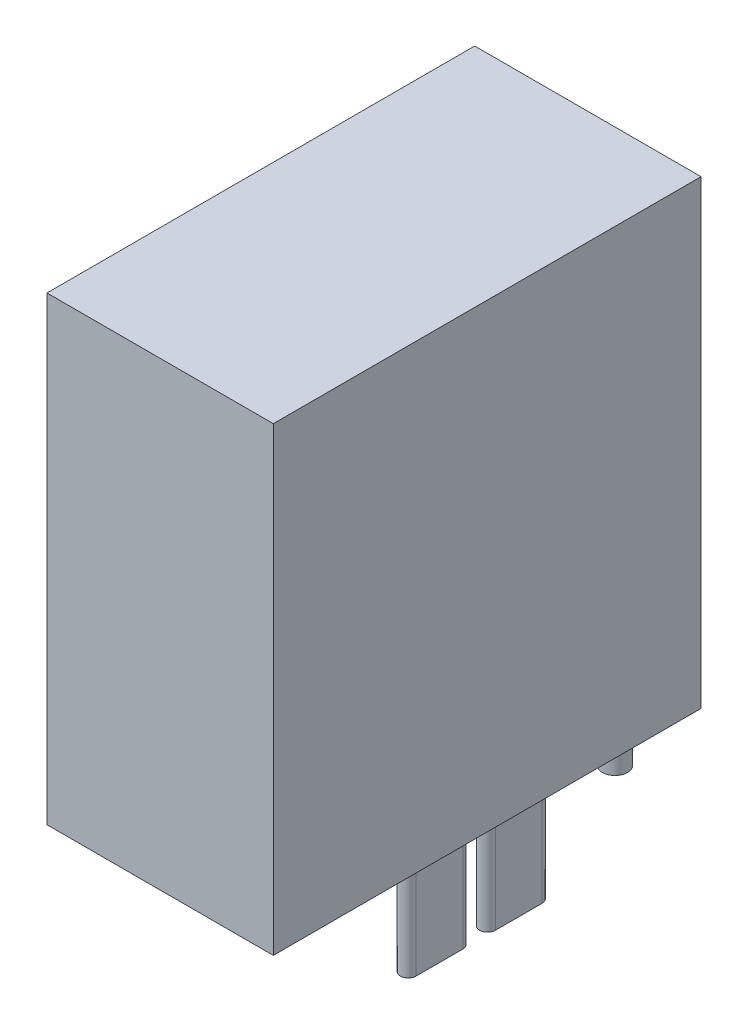
ISO-10303-21;
HEADER;
FILE_DESCRIPTION(('STEP AP214'),'2;1');
FILE_NAME('part.step','',(''),(''),'','','');
FILE_SCHEMA(('AUTOMOTIVE_DESIGN { 1 0 10303 214 1 1 1 1 }'));
ENDSEC;
DATA;
#1=APPLICATION_CONTEXT('core data for automotive mechanical design processes');
#2=APPLICATION_PROTOCOL_DEFINITION('international standard','automotive_design',2000,#1);
#3=PRODUCT_CONTEXT('',#1,'mechanical');
#4=PRODUCT('Part','Part','',(#3));
#5=PRODUCT_RELATED_PRODUCT_CATEGORY('part','',(#4));
#6=PRODUCT_DEFINITION_FORMATION('','',#4);
#7=PRODUCT_DEFINITION_CONTEXT('part definition',#1,'design');
#8=PRODUCT_DEFINITION('design','',#6,#7);
#9=PRODUCT_DEFINITION_SHAPE('','',#8);
#10=(LENGTH_UNIT() NAMED_UNIT(*) SI_UNIT(.MILLI.,.METRE.));
#11=(NAMED_UNIT(*) PLANE_ANGLE_UNIT() SI_UNIT($,.RADIAN.));
#12=(NAMED_UNIT(*) SI_UNIT($,.STERADIAN.) SOLID_ANGLE_UNIT());
#13=UNCERTAINTY_MEASURE_WITH_UNIT(LENGTH_MEASURE(1.E-05),#10,'distance_accuracy_value','');
#14=(GEOMETRIC_REPRESENTATION_CONTEXT(3) GLOBAL_UNCERTAINTY_ASSIGNED_CONTEXT((#13)) GLOBAL_UNIT_ASSIGNED_CONTEXT((#10,
#11,#12)) REPRESENTATION_CONTEXT('',''));
#15=CARTESIAN_POINT('',(0.,0.,0.));
#16=DIRECTION('',(0.,0.,1.));
#17=DIRECTION('',(1.,0.,0.));
#18=AXIS2_PLACEMENT_3D('',#15,#16,#17);
#19=CARTESIAN_POINT('',(0.,0.,13.7));
#20=DIRECTION('',(0.,1.,0.));
#21=DIRECTION('',(0.,0.,1.));
#22=AXIS2_PLACEMENT_3D('',#19,#20,#21);
#23=PLANE('',#22);
#24=CARTESIAN_POINT('',(1.25,0.,0.956934673366761));
#25=DIRECTION('',(0.,1.,0.));
#26=DIRECTION('',(0.,0.,1.));
#27=AXIS2_PLACEMENT_3D('',#24,#25,#26);
#28=CIRCLE('',#27,0.4);
#29=CARTESIAN_POINT('',(1.25,0.,1.35693467336676));
#30=VERTEX_POINT('',#29);
#31=EDGE_CURVE('E42',#30,#30,#28,.F.);
#32=ORIENTED_EDGE('',*,*,#31,.F.);
#33=EDGE_LOOP('',(#32));
#34=FACE_BOUND('',#33,.T.);
#35=CARTESIAN_POINT('',(4.05,0.,0.956934673366761));
#36=DIRECTION('',(0.,1.,0.));
#37=DIRECTION('',(0.,0.,1.));
#38=AXIS2_PLACEMENT_3D('',#35,#36,#37);
#39=CIRCLE('',#38,0.4);
#40=CARTESIAN_POINT('',(4.05,0.,1.35693467336676));
#41=VERTEX_POINT('',#40);
#42=EDGE_CURVE('E330',#41,#41,#39,.F.);
#43=ORIENTED_EDGE('',*,*,#42,.F.);
#44=EDGE_LOOP('',(#43));
#45=FACE_BOUND('',#44,.T.);
#46=CARTESIAN_POINT('',(6.21,0.,4.3));
#47=DIRECTION('',(0.,-1.,0.));
#48=DIRECTION('',(0.,0.,-1.));
#49=AXIS2_PLACEMENT_3D('',#46,#47,#48);
#50=CIRCLE('',#49,0.25);
#51=CARTESIAN_POINT('',(5.96,0.,4.3));
#52=VERTEX_POINT('',#51);
#53=CARTESIAN_POINT('',(6.46,0.,4.3));
#54=VERTEX_POINT('',#53);
#55=EDGE_CURVE('E201',#52,#54,#50,.T.);
#56=ORIENTED_EDGE('',*,*,#55,.F.);
#57=DIRECTION('',(0.,0.,-1.));
#58=VECTOR('',#57,1.);
#59=CARTESIAN_POINT('',(5.96,0.,4.3));
#60=LINE('',#59,#58);
#61=CARTESIAN_POINT('',(5.96,0.,5.8));
#62=VERTEX_POINT('',#61);
#63=EDGE_CURVE('E210',#62,#52,#60,.T.);
#64=ORIENTED_EDGE('',*,*,#63,.F.);
#65=CARTESIAN_POINT('',(6.21,0.,5.8));
#66=DIRECTION('',(0.,-1.,0.));
#67=DIRECTION('',(0.,0.,1.));
#68=AXIS2_PLACEMENT_3D('',#65,#66,#67);
#69=CIRCLE('',#68,0.25);
#70=CARTESIAN_POINT('',(6.46,0.,5.8));
#71=VERTEX_POINT('',#70);
#72=EDGE_CURVE('E207',#71,#62,#69,.T.);
#73=ORIENTED_EDGE('',*,*,#72,.F.);
#74=DIRECTION('',(0.,0.,1.));
#75=VECTOR('',#74,1.);
#76=CARTESIAN_POINT('',(6.46,0.,4.3));
#77=LINE('',#76,#75);
#78=EDGE_CURVE('E204',#54,#71,#77,.T.);
#79=ORIENTED_EDGE('',*,*,#78,.F.);
#80=EDGE_LOOP('',(#56,#64,#73,#79));
#81=FACE_BOUND('',#80,.T.);
#82=CARTESIAN_POINT('',(6.21,0.,6.84));
#83=DIRECTION('',(0.,-1.,0.));
#84=DIRECTION('',(0.,0.,-1.));
#85=AXIS2_PLACEMENT_3D('',#82,#83,#84);
#86=CIRCLE('',#85,0.25);
#87=CARTESIAN_POINT('',(5.96,0.,6.84));
#88=VERTEX_POINT('',#87);
#89=CARTESIAN_POINT('',(6.46,0.,6.84));
#90=VERTEX_POINT('',#89);
#91=EDGE_CURVE('E267',#88,#90,#86,.T.);
#92=ORIENTED_EDGE('',*,*,#91,.F.);
#93=DIRECTION('',(0.,0.,-1.));
#94=VECTOR('',#93,1.);
#95=CARTESIAN_POINT('',(5.96,0.,6.84));
#96=LINE('',#95,#94);
#97=CARTESIAN_POINT('',(5.96,0.,8.34));
#98=VERTEX_POINT('',#97);
#99=EDGE_CURVE('E276',#98,#88,#96,.T.);
#100=ORIENTED_EDGE('',*,*,#99,.F.);
#101=CARTESIAN_POINT('',(6.21,0.,8.34));
#102=DIRECTION('',(0.,-1.,0.));
#103=DIRECTION('',(0.,0.,1.));
#104=AXIS2_PLACEMENT_3D('',#101,#102,#103);
#105=CIRCLE('',#104,0.25);
#106=CARTESIAN_POINT('',(6.46,0.,8.34));
#107=VERTEX_POINT('',#106);
#108=EDGE_CURVE('E273',#107,#98,#105,.T.);
#109=ORIENTED_EDGE('',*,*,#108,.F.);
#110=DIRECTION('',(0.,0.,1.));
#111=VECTOR('',#110,1.);
#112=CARTESIAN_POINT('',(6.46,0.,6.84));
#113=LINE('',#112,#111);
#114=EDGE_CURVE('E270',#90,#107,#113,.T.);
#115=ORIENTED_EDGE('',*,*,#114,.F.);
#116=EDGE_LOOP('',(#92,#100,#109,#115));
#117=FACE_BOUND('',#116,.T.);
#118=DIRECTION('',(1.,0.,0.));
#119=VECTOR('',#118,1.);
#120=CARTESIAN_POINT('',(0.,0.,0.));
#121=LINE('',#120,#119);
#122=CARTESIAN_POINT('',(0.,0.,0.));
#123=VERTEX_POINT('',#122);
#124=CARTESIAN_POINT('',(7.25,0.,0.));
#125=VERTEX_POINT('',#124);
#126=EDGE_CURVE('E303',#123,#125,#121,.T.);
#127=ORIENTED_EDGE('',*,*,#126,.T.);
#128=DIRECTION('',(0.,0.,-1.));
#129=VECTOR('',#128,1.);
#130=CARTESIAN_POINT('',(7.25,0.,13.7));
#131=LINE('',#130,#129);
#132=CARTESIAN_POINT('',(7.25,0.,13.7));
#133=VERTEX_POINT('',#132);
#134=EDGE_CURVE('E324',#133,#125,#131,.T.);
#135=ORIENTED_EDGE('',*,*,#134,.F.);
#136=DIRECTION('',(1.,0.,0.));
#137=VECTOR('',#136,1.);
#138=CARTESIAN_POINT('',(0.,0.,13.7));
#139=LINE('',#138,#137);
#140=CARTESIAN_POINT('',(0.,0.,13.7));
#141=VERTEX_POINT('',#140);
#142=EDGE_CURVE('E312',#141,#133,#139,.T.);
#143=ORIENTED_EDGE('',*,*,#142,.F.);
#144=DIRECTION('',(0.,0.,-1.));
#145=VECTOR('',#144,1.);
#146=CARTESIAN_POINT('',(0.,0.,13.7));
#147=LINE('',#146,#145);
#148=EDGE_CURVE('E327',#141,#123,#147,.T.);
#149=ORIENTED_EDGE('',*,*,#148,.T.);
#150=EDGE_LOOP('',(#127,#135,#143,#149));
#151=FACE_BOUND('',#150,.T.);
#152=CARTESIAN_POINT('',(0.79,0.,6.84));
#153=DIRECTION('',(0.,-1.,0.));
#154=DIRECTION('',(0.,0.,-1.));
#155=AXIS2_PLACEMENT_3D('',#152,#153,#154);
#156=CIRCLE('',#155,0.25);
#157=CARTESIAN_POINT('',(0.54,0.,6.84));
#158=VERTEX_POINT('',#157);
#159=CARTESIAN_POINT('',(1.04,0.,6.84));
#160=VERTEX_POINT('',#159);
#161=EDGE_CURVE('E234',#158,#160,#156,.T.);
#162=ORIENTED_EDGE('',*,*,#161,.F.);
#163=DIRECTION('',(0.,0.,-1.));
#164=VECTOR('',#163,1.);
#165=CARTESIAN_POINT('',(0.54,0.,6.84));
#166=LINE('',#165,#164);
#167=CARTESIAN_POINT('',(0.54,0.,8.34));
#168=VERTEX_POINT('',#167);
#169=EDGE_CURVE('E243',#168,#158,#166,.T.);
#170=ORIENTED_EDGE('',*,*,#169,.F.);
#171=CARTESIAN_POINT('',(0.79,0.,8.34));
#172=DIRECTION('',(0.,-1.,0.));
#173=DIRECTION('',(0.,0.,1.));
#174=AXIS2_PLACEMENT_3D('',#171,#172,#173);
#175=CIRCLE('',#174,0.25);
#176=CARTESIAN_POINT('',(1.04,0.,8.34));
#177=VERTEX_POINT('',#176);
#178=EDGE_CURVE('E240',#177,#168,#175,.T.);
#179=ORIENTED_EDGE('',*,*,#178,.F.);
#180=DIRECTION('',(0.,0.,1.));
#181=VECTOR('',#180,1.);
#182=CARTESIAN_POINT('',(1.04,0.,6.84));
#183=LINE('',#182,#181);
#184=EDGE_CURVE('E237',#160,#177,#183,.T.);
#185=ORIENTED_EDGE('',*,*,#184,.F.);
#186=EDGE_LOOP('',(#162,#170,#179,#185));
#187=FACE_BOUND('',#186,.T.);
#188=CARTESIAN_POINT('',(0.79,0.,4.3));
#189=DIRECTION('',(0.,-1.,0.));
#190=DIRECTION('',(0.,0.,-1.));
#191=AXIS2_PLACEMENT_3D('',#188,#189,#190);
#192=CIRCLE('',#191,0.25);
#193=CARTESIAN_POINT('',(0.54,0.,4.3));
#194=VERTEX_POINT('',#193);
#195=CARTESIAN_POINT('',(1.04,0.,4.3));
#196=VERTEX_POINT('',#195);
#197=EDGE_CURVE('E167',#194,#196,#192,.T.);
#198=ORIENTED_EDGE('',*,*,#197,.F.);
#199=DIRECTION('',(0.,0.,-1.));
#200=VECTOR('',#199,1.);
#201=CARTESIAN_POINT('',(0.54,0.,4.3));
#202=LINE('',#201,#200);
#203=CARTESIAN_POINT('',(0.54,0.,5.8));
#204=VERTEX_POINT('',#203);
#205=EDGE_CURVE('E170',#204,#194,#202,.T.);
#206=ORIENTED_EDGE('',*,*,#205,.F.);
#207=CARTESIAN_POINT('',(0.79,0.,5.8));
#208=DIRECTION('',(0.,-1.,0.));
#209=DIRECTION('',(0.,0.,1.));
#210=AXIS2_PLACEMENT_3D('',#207,#208,#209);
#211=CIRCLE('',#210,0.25);
#212=CARTESIAN_POINT('',(1.04,0.,5.8));
#213=VERTEX_POINT('',#212);
#214=EDGE_CURVE('E54',#213,#204,#211,.T.);
#215=ORIENTED_EDGE('',*,*,#214,.F.);
#216=DIRECTION('',(0.,0.,1.));
#217=VECTOR('',#216,1.);
#218=CARTESIAN_POINT('',(1.04,0.,4.3));
#219=LINE('',#218,#217);
#220=EDGE_CURVE('E49',#196,#213,#219,.T.);
#221=ORIENTED_EDGE('',*,*,#220,.F.);
#222=EDGE_LOOP('',(#198,#206,#215,#221));
#223=FACE_BOUND('',#222,.T.);
#224=CARTESIAN_POINT('',(2.65,0.,0.956934673366761));
#225=DIRECTION('',(0.,1.,0.));
#226=DIRECTION('',(0.,0.,1.));
#227=AXIS2_PLACEMENT_3D('',#224,#225,#226);
#228=CIRCLE('',#227,0.4);
#229=CARTESIAN_POINT('',(2.65,0.,1.35693467336676));
#230=VERTEX_POINT('',#229);
#231=EDGE_CURVE('E333',#230,#230,#228,.F.);
#232=ORIENTED_EDGE('',*,*,#231,.F.);
#233=EDGE_LOOP('',(#232));
#234=FACE_BOUND('',#233,.T.);
#235=CARTESIAN_POINT('',(5.45,0.,0.956934673366761));
#236=DIRECTION('',(0.,1.,0.));
#237=DIRECTION('',(0.,0.,1.));
#238=AXIS2_PLACEMENT_3D('',#235,#236,#237);
#239=CIRCLE('',#238,0.4);
#240=CARTESIAN_POINT('',(5.45,0.,1.35693467336676));
#241=VERTEX_POINT('',#240);
#242=EDGE_CURVE('E11',#241,#241,#239,.F.);
#243=ORIENTED_EDGE('',*,*,#242,.F.);
#244=EDGE_LOOP('',(#243));
#245=FACE_BOUND('',#244,.T.);
#246=ADVANCED_FACE('F34',(#34,#45,#81,#117,#151,#187,#223,#234,#245),#23,.F.);
#247=CARTESIAN_POINT('',(0.,0.,13.7));
#248=DIRECTION('',(1.,0.,0.));
#249=DIRECTION('',(0.,0.,-1.));
#250=AXIS2_PLACEMENT_3D('',#247,#248,#249);
#251=PLANE('',#250);
#252=DIRECTION('',(0.,-1.,0.));
#253=VECTOR('',#252,1.);
#254=CARTESIAN_POINT('',(0.,0.,0.));
#255=LINE('',#254,#253);
#256=CARTESIAN_POINT('',(0.,14.75,0.));
#257=VERTEX_POINT('',#256);
#258=EDGE_CURVE('E300',#257,#123,#255,.T.);
#259=ORIENTED_EDGE('',*,*,#258,.T.);
#260=ORIENTED_EDGE('',*,*,#148,.F.);
#261=DIRECTION('',(0.,-1.,0.));
#262=VECTOR('',#261,1.);
#263=CARTESIAN_POINT('',(0.,0.,13.7));
#264=LINE('',#263,#262);
#265=CARTESIAN_POINT('',(0.,14.75,13.7));
#266=VERTEX_POINT('',#265);
#267=EDGE_CURVE('E309',#266,#141,#264,.T.);
#268=ORIENTED_EDGE('',*,*,#267,.F.);
#269=DIRECTION('',(0.,0.,-1.));
#270=VECTOR('',#269,1.);
#271=CARTESIAN_POINT('',(0.,14.75,13.7));
#272=LINE('',#271,#270);
#273=EDGE_CURVE('E318',#266,#257,#272,.T.);
#274=ORIENTED_EDGE('',*,*,#273,.T.);
#275=EDGE_LOOP('',(#259,#260,#268,#274));
#276=FACE_BOUND('',#275,.T.);
#277=ADVANCED_FACE('F36',(#276),#251,.F.);
#278=CARTESIAN_POINT('',(7.25,0.,13.7));
#279=DIRECTION('',(-1.,0.,0.));
#280=DIRECTION('',(0.,0.,1.));
#281=AXIS2_PLACEMENT_3D('',#278,#279,#280);
#282=PLANE('',#281);
#283=DIRECTION('',(0.,1.,0.));
#284=VECTOR('',#283,1.);
#285=CARTESIAN_POINT('',(7.25,0.,0.));
#286=LINE('',#285,#284);
#287=CARTESIAN_POINT('',(7.25,14.75,0.));
#288=VERTEX_POINT('',#287);
#289=EDGE_CURVE('E305',#125,#288,#286,.T.);
#290=ORIENTED_EDGE('',*,*,#289,.T.);
#291=DIRECTION('',(0.,0.,-1.));
#292=VECTOR('',#291,1.);
#293=CARTESIAN_POINT('',(7.25,14.75,13.7));
#294=LINE('',#293,#292);
#295=CARTESIAN_POINT('',(7.25,14.75,13.7));
#296=VERTEX_POINT('',#295);
#297=EDGE_CURVE('E321',#296,#288,#294,.T.);
#298=ORIENTED_EDGE('',*,*,#297,.F.);
#299=DIRECTION('',(0.,1.,0.));
#300=VECTOR('',#299,1.);
#301=CARTESIAN_POINT('',(7.25,0.,13.7));
#302=LINE('',#301,#300);
#303=EDGE_CURVE('E314',#133,#296,#302,.T.);
#304=ORIENTED_EDGE('',*,*,#303,.F.);
#305=ORIENTED_EDGE('',*,*,#134,.T.);
#306=EDGE_LOOP('',(#290,#298,#304,#305));
#307=FACE_BOUND('',#306,.T.);
#308=ADVANCED_FACE('F406',(#307),#282,.F.);
#309=CARTESIAN_POINT('',(0.,14.75,13.7));
#310=DIRECTION('',(0.,-1.,0.));
#311=DIRECTION('',(0.,0.,-1.));
#312=AXIS2_PLACEMENT_3D('',#309,#310,#311);
#313=PLANE('',#312);
#314=DIRECTION('',(-1.,0.,0.));
#315=VECTOR('',#314,1.);
#316=CARTESIAN_POINT('',(0.,14.75,0.));
#317=LINE('',#316,#315);
#318=EDGE_CURVE('E307',#288,#257,#317,.T.);
#319=ORIENTED_EDGE('',*,*,#318,.T.);
#320=ORIENTED_EDGE('',*,*,#273,.F.);
#321=DIRECTION('',(-1.,0.,0.));
#322=VECTOR('',#321,1.);
#323=CARTESIAN_POINT('',(0.,14.75,13.7));
#324=LINE('',#323,#322);
#325=EDGE_CURVE('E316',#296,#266,#324,.T.);
#326=ORIENTED_EDGE('',*,*,#325,.F.);
#327=ORIENTED_EDGE('',*,*,#297,.T.);
#328=EDGE_LOOP('',(#319,#320,#326,#327));
#329=FACE_BOUND('',#328,.T.);
#330=ADVANCED_FACE('F402',(#329),#313,.F.);
#331=CARTESIAN_POINT('',(0.,14.75,13.7));
#332=DIRECTION('',(0.,0.,-1.));
#333=DIRECTION('',(-1.,0.,0.));
#334=AXIS2_PLACEMENT_3D('',#331,#332,#333);
#335=PLANE('',#334);
#336=ORIENTED_EDGE('',*,*,#267,.T.);
#337=ORIENTED_EDGE('',*,*,#142,.T.);
#338=ORIENTED_EDGE('',*,*,#303,.T.);
#339=ORIENTED_EDGE('',*,*,#325,.T.);
#340=EDGE_LOOP('',(#336,#337,#338,#339));
#341=FACE_BOUND('',#340,.T.);
#342=ADVANCED_FACE('F398',(#341),#335,.F.);
#343=CARTESIAN_POINT('',(0.,14.75,0.));
#344=DIRECTION('',(0.,0.,-1.));
#345=DIRECTION('',(-1.,0.,0.));
#346=AXIS2_PLACEMENT_3D('',#343,#344,#345);
#347=PLANE('',#346);
#348=ORIENTED_EDGE('',*,*,#258,.F.);
#349=ORIENTED_EDGE('',*,*,#318,.F.);
#350=ORIENTED_EDGE('',*,*,#289,.F.);
#351=ORIENTED_EDGE('',*,*,#126,.F.);
#352=EDGE_LOOP('',(#348,#349,#350,#351));
#353=FACE_BOUND('',#352,.T.);
#354=ADVANCED_FACE('F394',(#353),#347,.T.);
#355=CARTESIAN_POINT('',(6.21,-3.65,6.84));
#356=DIRECTION('',(0.,1.,0.));
#357=DIRECTION('',(0.,0.,1.));
#358=AXIS2_PLACEMENT_3D('',#355,#356,#357);
#359=CYLINDRICAL_SURFACE('',#358,0.25);
#360=ORIENTED_EDGE('',*,*,#91,.T.);
#361=DIRECTION('',(0.,1.,0.));
#362=VECTOR('',#361,1.);
#363=CARTESIAN_POINT('',(6.46,-3.65,6.84));
#364=LINE('',#363,#362);
#365=CARTESIAN_POINT('',(6.46,-3.65,6.84));
#366=VERTEX_POINT('',#365);
#367=EDGE_CURVE('E297',#366,#90,#364,.T.);
#368=ORIENTED_EDGE('',*,*,#367,.F.);
#369=CARTESIAN_POINT('',(6.21,-3.65,6.84));
#370=DIRECTION('',(0.,-1.,0.));
#371=DIRECTION('',(0.,0.,-1.));
#372=AXIS2_PLACEMENT_3D('',#369,#370,#371);
#373=CIRCLE('',#372,0.25);
#374=CARTESIAN_POINT('',(5.96,-3.65,6.84));
#375=VERTEX_POINT('',#374);
#376=EDGE_CURVE('E279',#375,#366,#373,.T.);
#377=ORIENTED_EDGE('',*,*,#376,.F.);
#378=DIRECTION('',(0.,1.,0.));
#379=VECTOR('',#378,1.);
#380=CARTESIAN_POINT('',(5.96,-3.65,6.84));
#381=LINE('',#380,#379);
#382=EDGE_CURVE('E288',#375,#88,#381,.T.);
#383=ORIENTED_EDGE('',*,*,#382,.T.);
#384=EDGE_LOOP('',(#360,#368,#377,#383));
#385=FACE_BOUND('',#384,.T.);
#386=ADVANCED_FACE('F390',(#385),#359,.T.);
#387=CARTESIAN_POINT('',(6.46,-3.65,6.84));
#388=DIRECTION('',(-1.,0.,0.));
#389=DIRECTION('',(0.,0.,1.));
#390=AXIS2_PLACEMENT_3D('',#387,#388,#389);
#391=PLANE('',#390);
#392=ORIENTED_EDGE('',*,*,#114,.T.);
#393=DIRECTION('',(0.,1.,0.));
#394=VECTOR('',#393,1.);
#395=CARTESIAN_POINT('',(6.46,-3.65,8.34));
#396=LINE('',#395,#394);
#397=CARTESIAN_POINT('',(6.46,-3.65,8.34));
#398=VERTEX_POINT('',#397);
#399=EDGE_CURVE('E294',#398,#107,#396,.T.);
#400=ORIENTED_EDGE('',*,*,#399,.F.);
#401=DIRECTION('',(0.,0.,1.));
#402=VECTOR('',#401,1.);
#403=CARTESIAN_POINT('',(6.46,-3.65,6.84));
#404=LINE('',#403,#402);
#405=EDGE_CURVE('E282',#366,#398,#404,.T.);
#406=ORIENTED_EDGE('',*,*,#405,.F.);
#407=ORIENTED_EDGE('',*,*,#367,.T.);
#408=EDGE_LOOP('',(#392,#400,#406,#407));
#409=FACE_BOUND('',#408,.T.);
#410=ADVANCED_FACE('F386',(#409),#391,.F.);
#411=CARTESIAN_POINT('',(6.21,-3.65,8.34));
#412=DIRECTION('',(0.,1.,0.));
#413=DIRECTION('',(0.,0.,1.));
#414=AXIS2_PLACEMENT_3D('',#411,#412,#413);
#415=CYLINDRICAL_SURFACE('',#414,0.25);
#416=ORIENTED_EDGE('',*,*,#108,.T.);
#417=DIRECTION('',(0.,1.,0.));
#418=VECTOR('',#417,1.);
#419=CARTESIAN_POINT('',(5.96,-3.65,8.34));
#420=LINE('',#419,#418);
#421=CARTESIAN_POINT('',(5.96,-3.65,8.34));
#422=VERTEX_POINT('',#421);
#423=EDGE_CURVE('E291',#422,#98,#420,.T.);
#424=ORIENTED_EDGE('',*,*,#423,.F.);
#425=CARTESIAN_POINT('',(6.21,-3.65,8.34));
#426=DIRECTION('',(0.,-1.,0.));
#427=DIRECTION('',(0.,0.,1.));
#428=AXIS2_PLACEMENT_3D('',#425,#426,#427);
#429=CIRCLE('',#428,0.25);
#430=EDGE_CURVE('E284',#398,#422,#429,.T.);
#431=ORIENTED_EDGE('',*,*,#430,.F.);
#432=ORIENTED_EDGE('',*,*,#399,.T.);
#433=EDGE_LOOP('',(#416,#424,#431,#432));
#434=FACE_BOUND('',#433,.T.);
#435=ADVANCED_FACE('F382',(#434),#415,.T.);
#436=CARTESIAN_POINT('',(5.96,-3.65,6.84));
#437=DIRECTION('',(1.,0.,0.));
#438=DIRECTION('',(0.,0.,-1.));
#439=AXIS2_PLACEMENT_3D('',#436,#437,#438);
#440=PLANE('',#439);
#441=ORIENTED_EDGE('',*,*,#99,.T.);
#442=ORIENTED_EDGE('',*,*,#382,.F.);
#443=DIRECTION('',(0.,0.,-1.));
#444=VECTOR('',#443,1.);
#445=CARTESIAN_POINT('',(5.96,-3.65,6.84));
#446=LINE('',#445,#444);
#447=EDGE_CURVE('E286',#422,#375,#446,.T.);
#448=ORIENTED_EDGE('',*,*,#447,.F.);
#449=ORIENTED_EDGE('',*,*,#423,.T.);
#450=EDGE_LOOP('',(#441,#442,#448,#449));
#451=FACE_BOUND('',#450,.T.);
#452=ADVANCED_FACE('F378',(#451),#440,.F.);
#453=CARTESIAN_POINT('',(6.21,-3.65,6.84));
#454=DIRECTION('',(0.,-1.,0.));
#455=DIRECTION('',(0.,0.,-1.));
#456=AXIS2_PLACEMENT_3D('',#453,#454,#455);
#457=PLANE('',#456);
#458=ORIENTED_EDGE('',*,*,#376,.T.);
#459=ORIENTED_EDGE('',*,*,#405,.T.);
#460=ORIENTED_EDGE('',*,*,#430,.T.);
#461=ORIENTED_EDGE('',*,*,#447,.T.);
#462=EDGE_LOOP('',(#458,#459,#460,#461));
#463=FACE_BOUND('',#462,.T.);
#464=ADVANCED_FACE('F372',(#463),#457,.T.);
#465=CARTESIAN_POINT('',(0.79,-3.65,6.84));
#466=DIRECTION('',(0.,1.,0.));
#467=DIRECTION('',(0.,0.,1.));
#468=AXIS2_PLACEMENT_3D('',#465,#466,#467);
#469=CYLINDRICAL_SURFACE('',#468,0.25);
#470=ORIENTED_EDGE('',*,*,#161,.T.);
#471=DIRECTION('',(0.,1.,0.));
#472=VECTOR('',#471,1.);
#473=CARTESIAN_POINT('',(1.04,-3.65,6.84));
#474=LINE('',#473,#472);
#475=CARTESIAN_POINT('',(1.04,-3.65,6.84));
#476=VERTEX_POINT('',#475);
#477=EDGE_CURVE('E264',#476,#160,#474,.T.);
#478=ORIENTED_EDGE('',*,*,#477,.F.);
#479=CARTESIAN_POINT('',(0.79,-3.65,6.84));
#480=DIRECTION('',(0.,-1.,0.));
#481=DIRECTION('',(0.,0.,-1.));
#482=AXIS2_PLACEMENT_3D('',#479,#480,#481);
#483=CIRCLE('',#482,0.25);
#484=CARTESIAN_POINT('',(0.54,-3.65,6.84));
#485=VERTEX_POINT('',#484);
#486=EDGE_CURVE('E246',#485,#476,#483,.T.);
#487=ORIENTED_EDGE('',*,*,#486,.F.);
#488=DIRECTION('',(0.,1.,0.));
#489=VECTOR('',#488,1.);
#490=CARTESIAN_POINT('',(0.54,-3.65,6.84));
#491=LINE('',#490,#489);
#492=EDGE_CURVE('E255',#485,#158,#491,.T.);
#493=ORIENTED_EDGE('',*,*,#492,.T.);
#494=EDGE_LOOP('',(#470,#478,#487,#493));
#495=FACE_BOUND('',#494,.T.);
#496=ADVANCED_FACE('F356',(#495),#469,.T.);
#497=CARTESIAN_POINT('',(1.04,-3.65,6.84));
#498=DIRECTION('',(-1.,0.,0.));
#499=DIRECTION('',(0.,0.,1.));
#500=AXIS2_PLACEMENT_3D('',#497,#498,#499);
#501=PLANE('',#500);
#502=ORIENTED_EDGE('',*,*,#184,.T.);
#503=DIRECTION('',(0.,1.,0.));
#504=VECTOR('',#503,1.);
#505=CARTESIAN_POINT('',(1.04,-3.65,8.34));
#506=LINE('',#505,#504);
#507=CARTESIAN_POINT('',(1.04,-3.65,8.34));
#508=VERTEX_POINT('',#507);
#509=EDGE_CURVE('E261',#508,#177,#506,.T.);
#510=ORIENTED_EDGE('',*,*,#509,.F.);
#511=DIRECTION('',(0.,0.,1.));
#512=VECTOR('',#511,1.);
#513=CARTESIAN_POINT('',(1.04,-3.65,6.84));
#514=LINE('',#513,#512);
#515=EDGE_CURVE('E249',#476,#508,#514,.T.);
#516=ORIENTED_EDGE('',*,*,#515,.F.);
#517=ORIENTED_EDGE('',*,*,#477,.T.);
#518=EDGE_LOOP('',(#502,#510,#516,#517));
#519=FACE_BOUND('',#518,.T.);
#520=ADVANCED_FACE('F364',(#519),#501,.F.);
#521=CARTESIAN_POINT('',(0.79,-3.65,8.34));
#522=DIRECTION('',(0.,1.,0.));
#523=DIRECTION('',(0.,0.,1.));
#524=AXIS2_PLACEMENT_3D('',#521,#522,#523);
#525=CYLINDRICAL_SURFACE('',#524,0.25);
#526=ORIENTED_EDGE('',*,*,#178,.T.);
#527=DIRECTION('',(0.,1.,0.));
#528=VECTOR('',#527,1.);
#529=CARTESIAN_POINT('',(0.54,-3.65,8.34));
#530=LINE('',#529,#528);
#531=CARTESIAN_POINT('',(0.54,-3.65,8.34));
#532=VERTEX_POINT('',#531);
#533=EDGE_CURVE('E258',#532,#168,#530,.T.);
#534=ORIENTED_EDGE('',*,*,#533,.F.);
#535=CARTESIAN_POINT('',(0.79,-3.65,8.34));
#536=DIRECTION('',(0.,-1.,0.));
#537=DIRECTION('',(0.,0.,1.));
#538=AXIS2_PLACEMENT_3D('',#535,#536,#537);
#539=CIRCLE('',#538,0.25);
#540=EDGE_CURVE('E251',#508,#532,#539,.T.);
#541=ORIENTED_EDGE('',*,*,#540,.F.);
#542=ORIENTED_EDGE('',*,*,#509,.T.);
#543=EDGE_LOOP('',(#526,#534,#541,#542));
#544=FACE_BOUND('',#543,.T.);
#545=ADVANCED_FACE('F362',(#544),#525,.T.);
#546=CARTESIAN_POINT('',(0.54,-3.65,6.84));
#547=DIRECTION('',(1.,0.,0.));
#548=DIRECTION('',(0.,0.,-1.));
#549=AXIS2_PLACEMENT_3D('',#546,#547,#548);
#550=PLANE('',#549);
#551=ORIENTED_EDGE('',*,*,#169,.T.);
#552=ORIENTED_EDGE('',*,*,#492,.F.);
#553=DIRECTION('',(0.,0.,-1.));
#554=VECTOR('',#553,1.);
#555=CARTESIAN_POINT('',(0.54,-3.65,6.84));
#556=LINE('',#555,#554);
#557=EDGE_CURVE('E253',#532,#485,#556,.T.);
#558=ORIENTED_EDGE('',*,*,#557,.F.);
#559=ORIENTED_EDGE('',*,*,#533,.T.);
#560=EDGE_LOOP('',(#551,#552,#558,#559));
#561=FACE_BOUND('',#560,.T.);
#562=ADVANCED_FACE('F352',(#561),#550,.F.);
#563=CARTESIAN_POINT('',(0.79,-3.65,6.84));
#564=DIRECTION('',(0.,-1.,0.));
#565=DIRECTION('',(0.,0.,-1.));
#566=AXIS2_PLACEMENT_3D('',#563,#564,#565);
#567=PLANE('',#566);
#568=ORIENTED_EDGE('',*,*,#486,.T.);
#569=ORIENTED_EDGE('',*,*,#515,.T.);
#570=ORIENTED_EDGE('',*,*,#540,.T.);
#571=ORIENTED_EDGE('',*,*,#557,.T.);
#572=EDGE_LOOP('',(#568,#569,#570,#571));
#573=FACE_BOUND('',#572,.T.);
#574=ADVANCED_FACE('F358',(#573),#567,.T.);
#575=CARTESIAN_POINT('',(6.21,-3.65,4.3));
#576=DIRECTION('',(0.,1.,0.));
#577=DIRECTION('',(0.,0.,1.));
#578=AXIS2_PLACEMENT_3D('',#575,#576,#577);
#579=CYLINDRICAL_SURFACE('',#578,0.25);
#580=ORIENTED_EDGE('',*,*,#55,.T.);
#581=DIRECTION('',(0.,1.,0.));
#582=VECTOR('',#581,1.);
#583=CARTESIAN_POINT('',(6.46,-3.65,4.3));
#584=LINE('',#583,#582);
#585=CARTESIAN_POINT('',(6.46,-3.65,4.3));
#586=VERTEX_POINT('',#585);
#587=EDGE_CURVE('E231',#586,#54,#584,.T.);
#588=ORIENTED_EDGE('',*,*,#587,.F.);
#589=CARTESIAN_POINT('',(6.21,-3.65,4.3));
#590=DIRECTION('',(0.,-1.,0.));
#591=DIRECTION('',(0.,0.,-1.));
#592=AXIS2_PLACEMENT_3D('',#589,#590,#591);
#593=CIRCLE('',#592,0.25);
#594=CARTESIAN_POINT('',(5.96,-3.65,4.3));
#595=VERTEX_POINT('',#594);
#596=EDGE_CURVE('E213',#595,#586,#593,.T.);
#597=ORIENTED_EDGE('',*,*,#596,.F.);
#598=DIRECTION('',(0.,1.,0.));
#599=VECTOR('',#598,1.);
#600=CARTESIAN_POINT('',(5.96,-3.65,4.3));
#601=LINE('',#600,#599);
#602=EDGE_CURVE('E222',#595,#52,#601,.T.);
#603=ORIENTED_EDGE('',*,*,#602,.T.);
#604=EDGE_LOOP('',(#580,#588,#597,#603));
#605=FACE_BOUND('',#604,.T.);
#606=ADVANCED_FACE('F549',(#605),#579,.T.);
#607=CARTESIAN_POINT('',(6.46,-3.65,4.3));
#608=DIRECTION('',(-1.,0.,0.));
#609=DIRECTION('',(0.,0.,1.));
#610=AXIS2_PLACEMENT_3D('',#607,#608,#609);
#611=PLANE('',#610);
#612=ORIENTED_EDGE('',*,*,#78,.T.);
#613=DIRECTION('',(0.,1.,0.));
#614=VECTOR('',#613,1.);
#615=CARTESIAN_POINT('',(6.46,-3.65,5.8));
#616=LINE('',#615,#614);
#617=CARTESIAN_POINT('',(6.46,-3.65,5.8));
#618=VERTEX_POINT('',#617);
#619=EDGE_CURVE('E228',#618,#71,#616,.T.);
#620=ORIENTED_EDGE('',*,*,#619,.F.);
#621=DIRECTION('',(0.,0.,1.));
#622=VECTOR('',#621,1.);
#623=CARTESIAN_POINT('',(6.46,-3.65,4.3));
#624=LINE('',#623,#622);
#625=EDGE_CURVE('E216',#586,#618,#624,.T.);
#626=ORIENTED_EDGE('',*,*,#625,.F.);
#627=ORIENTED_EDGE('',*,*,#587,.T.);
#628=EDGE_LOOP('',(#612,#620,#626,#627));
#629=FACE_BOUND('',#628,.T.);
#630=ADVANCED_FACE('F545',(#629),#611,.F.);
#631=CARTESIAN_POINT('',(6.21,-3.65,5.8));
#632=DIRECTION('',(0.,1.,0.));
#633=DIRECTION('',(0.,0.,1.));
#634=AXIS2_PLACEMENT_3D('',#631,#632,#633);
#635=CYLINDRICAL_SURFACE('',#634,0.25);
#636=ORIENTED_EDGE('',*,*,#72,.T.);
#637=DIRECTION('',(0.,1.,0.));
#638=VECTOR('',#637,1.);
#639=CARTESIAN_POINT('',(5.96,-3.65,5.8));
#640=LINE('',#639,#638);
#641=CARTESIAN_POINT('',(5.96,-3.65,5.8));
#642=VERTEX_POINT('',#641);
#643=EDGE_CURVE('E225',#642,#62,#640,.T.);
#644=ORIENTED_EDGE('',*,*,#643,.F.);
#645=CARTESIAN_POINT('',(6.21,-3.65,5.8));
#646=DIRECTION('',(0.,-1.,0.));
#647=DIRECTION('',(0.,0.,1.));
#648=AXIS2_PLACEMENT_3D('',#645,#646,#647);
#649=CIRCLE('',#648,0.25);
#650=EDGE_CURVE('E218',#618,#642,#649,.T.);
#651=ORIENTED_EDGE('',*,*,#650,.F.);
#652=ORIENTED_EDGE('',*,*,#619,.T.);
#653=EDGE_LOOP('',(#636,#644,#651,#652));
#654=FACE_BOUND('',#653,.T.);
#655=ADVANCED_FACE('F541',(#654),#635,.T.);
#656=CARTESIAN_POINT('',(5.96,-3.65,4.3));
#657=DIRECTION('',(1.,0.,0.));
#658=DIRECTION('',(0.,0.,-1.));
#659=AXIS2_PLACEMENT_3D('',#656,#657,#658);
#660=PLANE('',#659);
#661=ORIENTED_EDGE('',*,*,#63,.T.);
#662=ORIENTED_EDGE('',*,*,#602,.F.);
#663=DIRECTION('',(0.,0.,-1.));
#664=VECTOR('',#663,1.);
#665=CARTESIAN_POINT('',(5.96,-3.65,4.3));
#666=LINE('',#665,#664);
#667=EDGE_CURVE('E220',#642,#595,#666,.T.);
#668=ORIENTED_EDGE('',*,*,#667,.F.);
#669=ORIENTED_EDGE('',*,*,#643,.T.);
#670=EDGE_LOOP('',(#661,#662,#668,#669));
#671=FACE_BOUND('',#670,.T.);
#672=ADVANCED_FACE('F537',(#671),#660,.F.);
#673=CARTESIAN_POINT('',(6.21,-3.65,4.3));
#674=DIRECTION('',(0.,-1.,0.));
#675=DIRECTION('',(0.,0.,-1.));
#676=AXIS2_PLACEMENT_3D('',#673,#674,#675);
#677=PLANE('',#676);
#678=ORIENTED_EDGE('',*,*,#596,.T.);
#679=ORIENTED_EDGE('',*,*,#625,.T.);
#680=ORIENTED_EDGE('',*,*,#650,.T.);
#681=ORIENTED_EDGE('',*,*,#667,.T.);
#682=EDGE_LOOP('',(#678,#679,#680,#681));
#683=FACE_BOUND('',#682,.T.);
#684=ADVANCED_FACE('F534',(#683),#677,.T.);
#685=CARTESIAN_POINT('',(0.79,-3.65,4.3));
#686=DIRECTION('',(0.,1.,0.));
#687=DIRECTION('',(0.,0.,1.));
#688=AXIS2_PLACEMENT_3D('',#685,#686,#687);
#689=CYLINDRICAL_SURFACE('',#688,0.25);
#690=ORIENTED_EDGE('',*,*,#197,.T.);
#691=DIRECTION('',(0.,1.,0.));
#692=VECTOR('',#691,1.);
#693=CARTESIAN_POINT('',(1.04,-3.65,4.3));
#694=LINE('',#693,#692);
#695=CARTESIAN_POINT('',(1.04,-3.65,4.3));
#696=VERTEX_POINT('',#695);
#697=EDGE_CURVE('E199',#696,#196,#694,.T.);
#698=ORIENTED_EDGE('',*,*,#697,.F.);
#699=CARTESIAN_POINT('',(0.79,-3.65,4.3));
#700=DIRECTION('',(0.,-1.,0.));
#701=DIRECTION('',(0.,0.,-1.));
#702=AXIS2_PLACEMENT_3D('',#699,#700,#701);
#703=CIRCLE('',#702,0.25);
#704=CARTESIAN_POINT('',(0.54,-3.65,4.3));
#705=VERTEX_POINT('',#704);
#706=EDGE_CURVE('E185',#705,#696,#703,.T.);
#707=ORIENTED_EDGE('',*,*,#706,.F.);
#708=DIRECTION('',(0.,1.,0.));
#709=VECTOR('',#708,1.);
#710=CARTESIAN_POINT('',(0.54,-3.65,4.3));
#711=LINE('',#710,#709);
#712=EDGE_CURVE('E181',#705,#194,#711,.T.);
#713=ORIENTED_EDGE('',*,*,#712,.T.);
#714=EDGE_LOOP('',(#690,#698,#707,#713));
#715=FACE_BOUND('',#714,.T.);
#716=ADVANCED_FACE('F187',(#715),#689,.T.);
#717=CARTESIAN_POINT('',(1.04,-3.65,4.3));
#718=DIRECTION('',(-1.,0.,0.));
#719=DIRECTION('',(0.,0.,1.));
#720=AXIS2_PLACEMENT_3D('',#717,#718,#719);
#721=PLANE('',#720);
#722=ORIENTED_EDGE('',*,*,#220,.T.);
#723=DIRECTION('',(0.,1.,0.));
#724=VECTOR('',#723,1.);
#725=CARTESIAN_POINT('',(1.04,-3.65,5.8));
#726=LINE('',#725,#724);
#727=CARTESIAN_POINT('',(1.04,-3.65,5.8));
#728=VERTEX_POINT('',#727);
#729=EDGE_CURVE('E191',#728,#213,#726,.T.);
#730=ORIENTED_EDGE('',*,*,#729,.F.);
#731=DIRECTION('',(0.,0.,1.));
#732=VECTOR('',#731,1.);
#733=CARTESIAN_POINT('',(1.04,-3.65,4.3));
#734=LINE('',#733,#732);
#735=EDGE_CURVE('E704',#696,#728,#734,.T.);
#736=ORIENTED_EDGE('',*,*,#735,.F.);
#737=ORIENTED_EDGE('',*,*,#697,.T.);
#738=EDGE_LOOP('',(#722,#730,#736,#737));
#739=FACE_BOUND('',#738,.T.);
#740=ADVANCED_FACE('F527',(#739),#721,.F.);
#741=CARTESIAN_POINT('',(0.79,-3.65,5.8));
#742=DIRECTION('',(0.,1.,0.));
#743=DIRECTION('',(0.,0.,1.));
#744=AXIS2_PLACEMENT_3D('',#741,#742,#743);
#745=CYLINDRICAL_SURFACE('',#744,0.25);
#746=ORIENTED_EDGE('',*,*,#214,.T.);
#747=DIRECTION('',(0.,1.,0.));
#748=VECTOR('',#747,1.);
#749=CARTESIAN_POINT('',(0.54,-3.65,5.8));
#750=LINE('',#749,#748);
#751=CARTESIAN_POINT('',(0.54,-3.65,5.8));
#752=VERTEX_POINT('',#751);
#753=EDGE_CURVE('E184',#752,#204,#750,.T.);
#754=ORIENTED_EDGE('',*,*,#753,.F.);
#755=CARTESIAN_POINT('',(0.79,-3.65,5.8));
#756=DIRECTION('',(0.,-1.,0.));
#757=DIRECTION('',(0.,0.,1.));
#758=AXIS2_PLACEMENT_3D('',#755,#756,#757);
#759=CIRCLE('',#758,0.25);
#760=EDGE_CURVE('E193',#728,#752,#759,.T.);
#761=ORIENTED_EDGE('',*,*,#760,.F.);
#762=ORIENTED_EDGE('',*,*,#729,.T.);
#763=EDGE_LOOP('',(#746,#754,#761,#762));
#764=FACE_BOUND('',#763,.T.);
#765=ADVANCED_FACE('F524',(#764),#745,.T.);
#766=CARTESIAN_POINT('',(0.54,-3.65,4.3));
#767=DIRECTION('',(1.,0.,0.));
#768=DIRECTION('',(0.,0.,-1.));
#769=AXIS2_PLACEMENT_3D('',#766,#767,#768);
#770=PLANE('',#769);
#771=ORIENTED_EDGE('',*,*,#205,.T.);
#772=ORIENTED_EDGE('',*,*,#712,.F.);
#773=DIRECTION('',(0.,0.,-1.));
#774=VECTOR('',#773,1.);
#775=CARTESIAN_POINT('',(0.54,-3.65,4.3));
#776=LINE('',#775,#774);
#777=EDGE_CURVE('E189',#752,#705,#776,.T.);
#778=ORIENTED_EDGE('',*,*,#777,.F.);
#779=ORIENTED_EDGE('',*,*,#753,.T.);
#780=EDGE_LOOP('',(#771,#772,#778,#779));
#781=FACE_BOUND('',#780,.T.);
#782=ADVANCED_FACE('F179',(#781),#770,.F.);
#783=CARTESIAN_POINT('',(0.79,-3.65,4.3));
#784=DIRECTION('',(0.,-1.,0.));
#785=DIRECTION('',(0.,0.,-1.));
#786=AXIS2_PLACEMENT_3D('',#783,#784,#785);
#787=PLANE('',#786);
#788=ORIENTED_EDGE('',*,*,#706,.T.);
#789=ORIENTED_EDGE('',*,*,#735,.T.);
#790=ORIENTED_EDGE('',*,*,#760,.T.);
#791=ORIENTED_EDGE('',*,*,#777,.T.);
#792=EDGE_LOOP('',(#788,#789,#790,#791));
#793=FACE_BOUND('',#792,.T.);
#794=ADVANCED_FACE('F437',(#793),#787,.T.);
#795=CARTESIAN_POINT('',(4.05,-2.,0.956934673366761));
#796=DIRECTION('',(0.,1.,0.));
#797=DIRECTION('',(0.,0.,1.));
#798=AXIS2_PLACEMENT_3D('',#795,#796,#797);
#799=CYLINDRICAL_SURFACE('',#798,0.4);
#800=CARTESIAN_POINT('',(4.05,-2.,0.956934673366761));
#801=DIRECTION('',(0.,-1.,0.));
#802=DIRECTION('',(0.,0.,-1.));
#803=AXIS2_PLACEMENT_3D('',#800,#801,#802);
#804=CIRCLE('',#803,0.4);
#805=CARTESIAN_POINT('',(4.05,-2.,0.556934673366761));
#806=VERTEX_POINT('',#805);
#807=EDGE_CURVE('E174',#806,#806,#804,.T.);
#808=ORIENTED_EDGE('',*,*,#807,.F.);
#809=EDGE_LOOP('',(#808));
#810=FACE_BOUND('',#809,.T.);
#811=ORIENTED_EDGE('',*,*,#42,.T.);
#812=EDGE_LOOP('',(#811));
#813=FACE_BOUND('',#812,.T.);
#814=ADVANCED_FACE('F441',(#810,#813),#799,.T.);
#815=CARTESIAN_POINT('',(4.05,-2.,0.956934673366761));
#816=DIRECTION('',(0.,-1.,0.));
#817=DIRECTION('',(0.,0.,-1.));
#818=AXIS2_PLACEMENT_3D('',#815,#816,#817);
#819=PLANE('',#818);
#820=ORIENTED_EDGE('',*,*,#807,.T.);
#821=EDGE_LOOP('',(#820));
#822=FACE_BOUND('',#821,.T.);
#823=ADVANCED_FACE('F445',(#822),#819,.T.);
#824=CARTESIAN_POINT('',(2.65,-2.,0.956934673366761));
#825=DIRECTION('',(0.,1.,0.));
#826=DIRECTION('',(0.,0.,1.));
#827=AXIS2_PLACEMENT_3D('',#824,#825,#826);
#828=CYLINDRICAL_SURFACE('',#827,0.4);
#829=CARTESIAN_POINT('',(2.65,-2.,0.956934673366761));
#830=DIRECTION('',(0.,-1.,0.));
#831=DIRECTION('',(0.,0.,-1.));
#832=AXIS2_PLACEMENT_3D('',#829,#830,#831);
#833=CIRCLE('',#832,0.4);
#834=CARTESIAN_POINT('',(2.65,-2.,0.556934673366761));
#835=VERTEX_POINT('',#834);
#836=EDGE_CURVE('E711',#835,#835,#833,.T.);
#837=ORIENTED_EDGE('',*,*,#836,.F.);
#838=EDGE_LOOP('',(#837));
#839=FACE_BOUND('',#838,.T.);
#840=ORIENTED_EDGE('',*,*,#231,.T.);
#841=EDGE_LOOP('',(#840));
#842=FACE_BOUND('',#841,.T.);
#843=ADVANCED_FACE('F455',(#839,#842),#828,.T.);
#844=CARTESIAN_POINT('',(2.65,-2.,0.956934673366761));
#845=DIRECTION('',(0.,-1.,0.));
#846=DIRECTION('',(0.,0.,-1.));
#847=AXIS2_PLACEMENT_3D('',#844,#845,#846);
#848=PLANE('',#847);
#849=ORIENTED_EDGE('',*,*,#836,.T.);
#850=EDGE_LOOP('',(#849));
#851=FACE_BOUND('',#850,.T.);
#852=ADVANCED_FACE('F465',(#851),#848,.T.);
#853=CARTESIAN_POINT('',(1.25,-2.,0.956934673366761));
#854=DIRECTION('',(0.,1.,0.));
#855=DIRECTION('',(0.,0.,1.));
#856=AXIS2_PLACEMENT_3D('',#853,#854,#855);
#857=CYLINDRICAL_SURFACE('',#856,0.4);
#858=CARTESIAN_POINT('',(1.25,-2.,0.956934673366761));
#859=DIRECTION('',(0.,-1.,0.));
#860=DIRECTION('',(0.,0.,-1.));
#861=AXIS2_PLACEMENT_3D('',#858,#859,#860);
#862=CIRCLE('',#861,0.4);
#863=CARTESIAN_POINT('',(1.25,-2.,0.556934673366761));
#864=VERTEX_POINT('',#863);
#865=EDGE_CURVE('E714',#864,#864,#862,.T.);
#866=ORIENTED_EDGE('',*,*,#865,.F.);
#867=EDGE_LOOP('',(#866));
#868=FACE_BOUND('',#867,.T.);
#869=ORIENTED_EDGE('',*,*,#31,.T.);
#870=EDGE_LOOP('',(#869));
#871=FACE_BOUND('',#870,.T.);
#872=ADVANCED_FACE('F338',(#868,#871),#857,.T.);
#873=CARTESIAN_POINT('',(1.25,-2.,0.956934673366761));
#874=DIRECTION('',(0.,-1.,0.));
#875=DIRECTION('',(0.,0.,-1.));
#876=AXIS2_PLACEMENT_3D('',#873,#874,#875);
#877=PLANE('',#876);
#878=ORIENTED_EDGE('',*,*,#865,.T.);
#879=EDGE_LOOP('',(#878));
#880=FACE_BOUND('',#879,.T.);
#881=ADVANCED_FACE('F484',(#880),#877,.T.);
#882=CARTESIAN_POINT('',(5.45,-2.,0.956934673366761));
#883=DIRECTION('',(0.,1.,0.));
#884=DIRECTION('',(0.,0.,1.));
#885=AXIS2_PLACEMENT_3D('',#882,#883,#884);
#886=CYLINDRICAL_SURFACE('',#885,0.4);
#887=CARTESIAN_POINT('',(5.45,-2.,0.956934673366761));
#888=DIRECTION('',(0.,-1.,0.));
#889=DIRECTION('',(0.,0.,-1.));
#890=AXIS2_PLACEMENT_3D('',#887,#888,#889);
#891=CIRCLE('',#890,0.4);
#892=CARTESIAN_POINT('',(5.45,-2.,0.556934673366761));
#893=VERTEX_POINT('',#892);
#894=EDGE_CURVE('E717',#893,#893,#891,.T.);
#895=ORIENTED_EDGE('',*,*,#894,.F.);
#896=EDGE_LOOP('',(#895));
#897=FACE_BOUND('',#896,.T.);
#898=ORIENTED_EDGE('',*,*,#242,.T.);
#899=EDGE_LOOP('',(#898));
#900=FACE_BOUND('',#899,.T.);
#901=ADVANCED_FACE('F494',(#897,#900),#886,.T.);
#902=CARTESIAN_POINT('',(5.45,-2.,0.956934673366761));
#903=DIRECTION('',(0.,-1.,0.));
#904=DIRECTION('',(0.,0.,-1.));
#905=AXIS2_PLACEMENT_3D('',#902,#903,#904);
#906=PLANE('',#905);
#907=ORIENTED_EDGE('',*,*,#894,.T.);
#908=EDGE_LOOP('',(#907));
#909=FACE_BOUND('',#908,.T.);
#910=ADVANCED_FACE('F504',(#909),#906,.T.);
#911=CLOSED_SHELL('',(#246,#277,#308,#330,#342,#354,#386,#410,#435,#452,#464,#496,#520,#545,
#562,#574,#606,#630,#655,#672,#684,#716,#740,#765,#782,#794,#814,#823,#843,#852,#872,#881,#901,#910));
#912=MANIFOLD_SOLID_BREP('B2',#911);
#913=ADVANCED_BREP_SHAPE_REPRESENTATION('',(#18,#912),#14);
#914=SHAPE_DEFINITION_REPRESENTATION(#9,#913);
ENDSEC;
END-ISO-10303-21;
